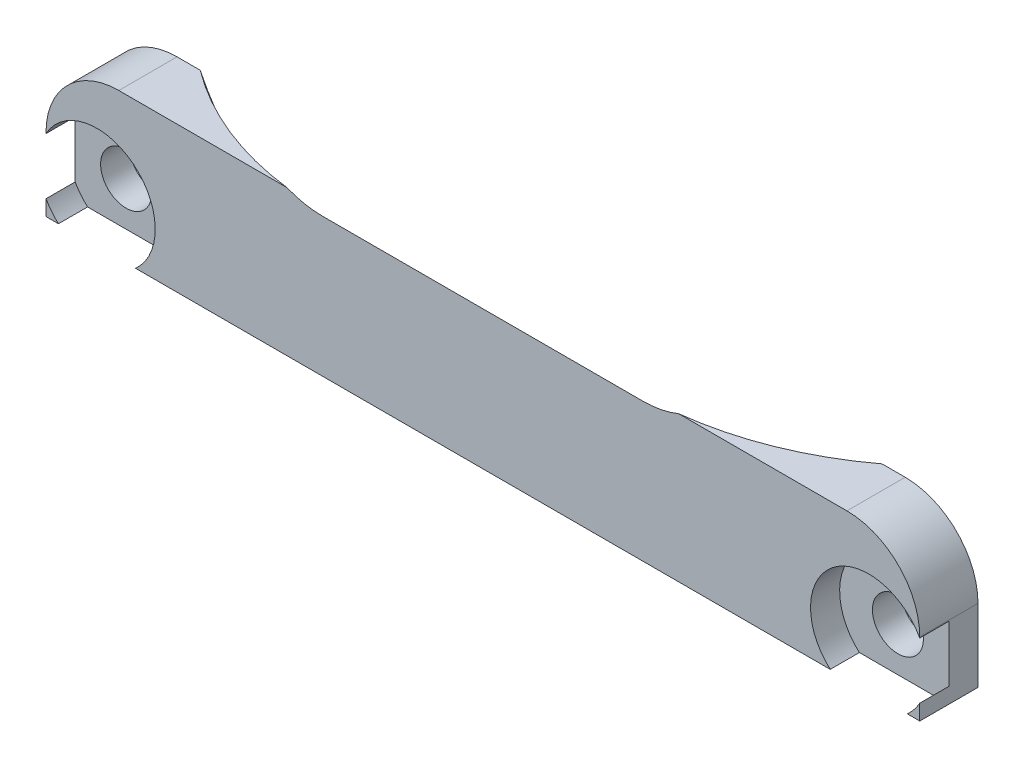
ISO-10303-21;
HEADER;
FILE_DESCRIPTION(('STEP AP214'),'2;1');
FILE_NAME('part.step','',(''),(''),'','','');
FILE_SCHEMA(('AUTOMOTIVE_DESIGN { 1 0 10303 214 1 1 1 1 }'));
ENDSEC;
DATA;
#1=APPLICATION_CONTEXT('core data for automotive mechanical design processes');
#2=APPLICATION_PROTOCOL_DEFINITION('international standard','automotive_design',2000,#1);
#3=PRODUCT_CONTEXT('',#1,'mechanical');
#4=PRODUCT('Part','Part','',(#3));
#5=PRODUCT_RELATED_PRODUCT_CATEGORY('part','',(#4));
#6=PRODUCT_DEFINITION_FORMATION('','',#4);
#7=PRODUCT_DEFINITION_CONTEXT('part definition',#1,'design');
#8=PRODUCT_DEFINITION('design','',#6,#7);
#9=PRODUCT_DEFINITION_SHAPE('','',#8);
#10=(LENGTH_UNIT() NAMED_UNIT(*) SI_UNIT(.MILLI.,.METRE.));
#11=(NAMED_UNIT(*) PLANE_ANGLE_UNIT() SI_UNIT($,.RADIAN.));
#12=(NAMED_UNIT(*) SI_UNIT($,.STERADIAN.) SOLID_ANGLE_UNIT());
#13=UNCERTAINTY_MEASURE_WITH_UNIT(LENGTH_MEASURE(1.E-05),#10,'distance_accuracy_value','');
#14=(GEOMETRIC_REPRESENTATION_CONTEXT(3) GLOBAL_UNCERTAINTY_ASSIGNED_CONTEXT((#13)) GLOBAL_UNIT_ASSIGNED_CONTEXT((#10,
#11,#12)) REPRESENTATION_CONTEXT('',''));
#15=CARTESIAN_POINT('',(0.,0.,0.));
#16=DIRECTION('',(0.,0.,1.));
#17=DIRECTION('',(1.,0.,0.));
#18=AXIS2_PLACEMENT_3D('',#15,#16,#17);
#19=CARTESIAN_POINT('',(0.,0.,20.5));
#20=DIRECTION('',(0.,0.,1.));
#21=DIRECTION('',(1.,0.,0.));
#22=AXIS2_PLACEMENT_3D('',#19,#20,#21);
#23=PLANE('',#22);
#24=CARTESIAN_POINT('',(26.5,-2.,20.5));
#25=DIRECTION('',(0.,0.,1.));
#26=DIRECTION('',(1.,0.,0.));
#27=AXIS2_PLACEMENT_3D('',#24,#25,#26);
#28=CIRCLE('',#27,4.);
#29=CARTESIAN_POINT('',(30.,-0.0635083268963044,20.5));
#30=VERTEX_POINT('',#29);
#31=CARTESIAN_POINT('',(23.8542486889354,-5.,20.5));
#32=VERTEX_POINT('',#31);
#33=EDGE_CURVE('E236',#30,#32,#28,.T.);
#34=ORIENTED_EDGE('',*,*,#33,.F.);
#35=DIRECTION('',(0.,1.,0.));
#36=VECTOR('',#35,1.);
#37=CARTESIAN_POINT('',(30.,5.,20.5));
#38=LINE('',#37,#36);
#39=CARTESIAN_POINT('',(30.,0.,20.5));
#40=VERTEX_POINT('',#39);
#41=EDGE_CURVE('E304',#30,#40,#38,.T.);
#42=ORIENTED_EDGE('',*,*,#41,.T.);
#43=CARTESIAN_POINT('',(25.,0.,20.5));
#44=DIRECTION('',(0.,0.,1.));
#45=DIRECTION('',(1.,0.,0.));
#46=AXIS2_PLACEMENT_3D('',#43,#44,#45);
#47=CIRCLE('',#46,5.);
#48=CARTESIAN_POINT('',(25.,5.,20.5));
#49=VERTEX_POINT('',#48);
#50=EDGE_CURVE('E220',#40,#49,#47,.T.);
#51=ORIENTED_EDGE('',*,*,#50,.T.);
#52=DIRECTION('',(-1.,0.,0.));
#53=VECTOR('',#52,1.);
#54=CARTESIAN_POINT('',(-30.,5.,20.5));
#55=LINE('',#54,#53);
#56=CARTESIAN_POINT('',(13.4494897427831,5.,20.5));
#57=VERTEX_POINT('',#56);
#58=EDGE_CURVE('E195',#49,#57,#55,.T.);
#59=ORIENTED_EDGE('',*,*,#58,.T.);
#60=CARTESIAN_POINT('',(11.,11.,20.5));
#61=DIRECTION('',(0.,0.,1.));
#62=DIRECTION('',(1.,0.,0.));
#63=AXIS2_PLACEMENT_3D('',#60,#61,#62);
#64=CIRCLE('',#63,6.48074069840783);
#65=CARTESIAN_POINT('',(11.,4.51925930159217,20.5));
#66=VERTEX_POINT('',#65);
#67=EDGE_CURVE('E293',#66,#57,#64,.T.);
#68=ORIENTED_EDGE('',*,*,#67,.F.);
#69=DIRECTION('',(-1.,0.,0.));
#70=VECTOR('',#69,1.);
#71=CARTESIAN_POINT('',(-32.5,4.51925930159217,20.5));
#72=LINE('',#71,#70);
#73=CARTESIAN_POINT('',(-11.,4.51925930159217,20.5));
#74=VERTEX_POINT('',#73);
#75=EDGE_CURVE('E296',#74,#66,#72,.F.);
#76=ORIENTED_EDGE('',*,*,#75,.F.);
#77=CARTESIAN_POINT('',(-11.,11.,20.5));
#78=DIRECTION('',(0.,0.,1.));
#79=DIRECTION('',(1.,0.,0.));
#80=AXIS2_PLACEMENT_3D('',#77,#78,#79);
#81=CIRCLE('',#80,6.48074069840783);
#82=CARTESIAN_POINT('',(-13.4494897427831,5.,20.5));
#83=VERTEX_POINT('',#82);
#84=EDGE_CURVE('E302',#83,#74,#81,.T.);
#85=ORIENTED_EDGE('',*,*,#84,.F.);
#86=CARTESIAN_POINT('',(-25.,5.,20.5));
#87=VERTEX_POINT('',#86);
#88=EDGE_CURVE('E307',#83,#87,#55,.T.);
#89=ORIENTED_EDGE('',*,*,#88,.T.);
#90=CARTESIAN_POINT('',(-25.,0.,20.5));
#91=DIRECTION('',(0.,0.,1.));
#92=DIRECTION('',(1.,0.,0.));
#93=AXIS2_PLACEMENT_3D('',#90,#91,#92);
#94=CIRCLE('',#93,5.);
#95=CARTESIAN_POINT('',(-30.,0.,20.5));
#96=VERTEX_POINT('',#95);
#97=EDGE_CURVE('E188',#87,#96,#94,.T.);
#98=ORIENTED_EDGE('',*,*,#97,.T.);
#99=DIRECTION('',(0.,-1.,0.));
#100=VECTOR('',#99,1.);
#101=CARTESIAN_POINT('',(-30.,5.,20.5));
#102=LINE('',#101,#100);
#103=CARTESIAN_POINT('',(-30.,-0.0635083268962795,20.5));
#104=VERTEX_POINT('',#103);
#105=EDGE_CURVE('E179',#96,#104,#102,.T.);
#106=ORIENTED_EDGE('',*,*,#105,.T.);
#107=CARTESIAN_POINT('',(-26.5,-2.,20.5));
#108=DIRECTION('',(0.,0.,1.));
#109=DIRECTION('',(1.,0.,0.));
#110=AXIS2_PLACEMENT_3D('',#107,#108,#109);
#111=CIRCLE('',#110,4.);
#112=CARTESIAN_POINT('',(-23.8542486889354,-5.,20.5));
#113=VERTEX_POINT('',#112);
#114=EDGE_CURVE('E162',#113,#104,#111,.T.);
#115=ORIENTED_EDGE('',*,*,#114,.F.);
#116=DIRECTION('',(1.,0.,0.));
#117=VECTOR('',#116,1.);
#118=CARTESIAN_POINT('',(-30.,-5.,20.5));
#119=LINE('',#118,#117);
#120=EDGE_CURVE('E192',#113,#32,#119,.T.);
#121=ORIENTED_EDGE('',*,*,#120,.T.);
#122=EDGE_LOOP('',(#34,#42,#51,#59,#68,#76,#85,#89,#98,#106,#115,#121));
#123=FACE_BOUND('',#122,.T.);
#124=ADVANCED_FACE('F37',(#123),#23,.T.);
#125=CARTESIAN_POINT('',(-30.,-3.93649167310372,20.5));
#126=VERTEX_POINT('',#125);
#127=CARTESIAN_POINT('',(-29.1457513110646,-5.,20.5));
#128=VERTEX_POINT('',#127);
#129=EDGE_CURVE('E171',#126,#128,#111,.T.);
#130=ORIENTED_EDGE('',*,*,#129,.F.);
#131=CARTESIAN_POINT('',(-30.,-5.,20.5));
#132=VERTEX_POINT('',#131);
#133=EDGE_CURVE('E190',#126,#132,#102,.T.);
#134=ORIENTED_EDGE('',*,*,#133,.T.);
#135=EDGE_CURVE('E194',#132,#128,#119,.T.);
#136=ORIENTED_EDGE('',*,*,#135,.T.);
#137=EDGE_LOOP('',(#130,#134,#136));
#138=FACE_BOUND('',#137,.T.);
#139=ADVANCED_FACE('F361',(#138),#23,.T.);
#140=CARTESIAN_POINT('',(26.5,-2.,16.5));
#141=DIRECTION('',(0.,0.,1.));
#142=DIRECTION('',(1.,0.,0.));
#143=AXIS2_PLACEMENT_3D('',#140,#141,#142);
#144=CYLINDRICAL_SURFACE('',#143,1.75);
#145=CARTESIAN_POINT('',(26.5,-2.,16.5));
#146=DIRECTION('',(0.,0.,1.));
#147=DIRECTION('',(1.,0.,0.));
#148=AXIS2_PLACEMENT_3D('',#145,#146,#147);
#149=CIRCLE('',#148,1.75);
#150=CARTESIAN_POINT('',(28.25,-2.,16.5));
#151=VERTEX_POINT('',#150);
#152=EDGE_CURVE('E262',#151,#151,#149,.T.);
#153=ORIENTED_EDGE('',*,*,#152,.F.);
#154=EDGE_LOOP('',(#153));
#155=FACE_BOUND('',#154,.T.);
#156=CARTESIAN_POINT('',(26.5,-2.,18.5));
#157=DIRECTION('',(0.,0.,1.));
#158=DIRECTION('',(1.,0.,0.));
#159=AXIS2_PLACEMENT_3D('',#156,#157,#158);
#160=CIRCLE('',#159,1.75);
#161=CARTESIAN_POINT('',(28.25,-2.,18.5));
#162=VERTEX_POINT('',#161);
#163=EDGE_CURVE('E41',#162,#162,#160,.F.);
#164=ORIENTED_EDGE('',*,*,#163,.F.);
#165=EDGE_LOOP('',(#164));
#166=FACE_BOUND('',#165,.T.);
#167=ADVANCED_FACE('F363',(#155,#166),#144,.F.);
#168=CARTESIAN_POINT('',(-26.5,-2.,16.5));
#169=DIRECTION('',(0.,0.,1.));
#170=DIRECTION('',(1.,0.,0.));
#171=AXIS2_PLACEMENT_3D('',#168,#169,#170);
#172=CYLINDRICAL_SURFACE('',#171,1.75);
#173=CARTESIAN_POINT('',(-26.5,-2.,16.5));
#174=DIRECTION('',(0.,0.,1.));
#175=DIRECTION('',(1.,0.,0.));
#176=AXIS2_PLACEMENT_3D('',#173,#174,#175);
#177=CIRCLE('',#176,1.75);
#178=CARTESIAN_POINT('',(-24.75,-2.,16.5));
#179=VERTEX_POINT('',#178);
#180=EDGE_CURVE('E263',#179,#179,#177,.T.);
#181=ORIENTED_EDGE('',*,*,#180,.F.);
#182=EDGE_LOOP('',(#181));
#183=FACE_BOUND('',#182,.T.);
#184=CARTESIAN_POINT('',(-26.5,-2.,18.5));
#185=DIRECTION('',(0.,0.,1.));
#186=DIRECTION('',(1.,0.,0.));
#187=AXIS2_PLACEMENT_3D('',#184,#185,#186);
#188=CIRCLE('',#187,1.75);
#189=CARTESIAN_POINT('',(-24.75,-2.,18.5));
#190=VERTEX_POINT('',#189);
#191=EDGE_CURVE('E222',#190,#190,#188,.F.);
#192=ORIENTED_EDGE('',*,*,#191,.F.);
#193=EDGE_LOOP('',(#192));
#194=FACE_BOUND('',#193,.T.);
#195=ADVANCED_FACE('F369',(#183,#194),#172,.F.);
#196=CARTESIAN_POINT('',(-30.,5.,20.5));
#197=DIRECTION('',(0.,-1.,0.));
#198=DIRECTION('',(0.,0.,-1.));
#199=AXIS2_PLACEMENT_3D('',#196,#197,#198);
#200=PLANE('',#199);
#201=DIRECTION('',(1.,0.,0.));
#202=VECTOR('',#201,1.);
#203=CARTESIAN_POINT('',(-30.,5.,16.5));
#204=LINE('',#203,#202);
#205=CARTESIAN_POINT('',(-25.,5.,16.5));
#206=VERTEX_POINT('',#205);
#207=CARTESIAN_POINT('',(-23.4096736459908,5.,16.5));
#208=VERTEX_POINT('',#207);
#209=EDGE_CURVE('E273',#206,#208,#204,.T.);
#210=ORIENTED_EDGE('',*,*,#209,.F.);
#211=DIRECTION('',(0.,0.,-1.));
#212=VECTOR('',#211,1.);
#213=CARTESIAN_POINT('',(-25.,5.,20.5));
#214=LINE('',#213,#212);
#215=EDGE_CURVE('E11',#206,#87,#214,.F.);
#216=ORIENTED_EDGE('',*,*,#215,.T.);
#217=ORIENTED_EDGE('',*,*,#88,.F.);
#218=CARTESIAN_POINT('',(-11.,5.,0.));
#219=DIRECTION('',(0.,-1.,0.));
#220=DIRECTION('',(0.,0.,-1.));
#221=AXIS2_PLACEMENT_3D('',#218,#219,#220);
#222=CIRCLE('',#221,20.6458228220626);
#223=EDGE_CURVE('E299',#83,#208,#222,.T.);
#224=ORIENTED_EDGE('',*,*,#223,.T.);
#225=EDGE_LOOP('',(#210,#216,#217,#224));
#226=FACE_BOUND('',#225,.T.);
#227=ADVANCED_FACE('F340',(#226),#200,.F.);
#228=CARTESIAN_POINT('',(30.,5.,20.5));
#229=DIRECTION('',(-1.,0.,0.));
#230=DIRECTION('',(0.,0.,1.));
#231=AXIS2_PLACEMENT_3D('',#228,#229,#230);
#232=PLANE('',#231);
#233=DIRECTION('',(0.,1.,0.));
#234=VECTOR('',#233,1.);
#235=CARTESIAN_POINT('',(30.,5.,18.5));
#236=LINE('',#235,#234);
#237=CARTESIAN_POINT('',(30.,-3.93649167310369,18.5));
#238=VERTEX_POINT('',#237);
#239=CARTESIAN_POINT('',(30.,-0.0635083268963044,18.5));
#240=VERTEX_POINT('',#239);
#241=EDGE_CURVE('E245',#238,#240,#236,.T.);
#242=ORIENTED_EDGE('',*,*,#241,.F.);
#243=DIRECTION('',(0.,0.,1.));
#244=VECTOR('',#243,1.);
#245=CARTESIAN_POINT('',(30.,-3.93649167310369,18.5));
#246=LINE('',#245,#244);
#247=CARTESIAN_POINT('',(30.,-3.93649167310369,20.5));
#248=VERTEX_POINT('',#247);
#249=EDGE_CURVE('E259',#238,#248,#246,.T.);
#250=ORIENTED_EDGE('',*,*,#249,.T.);
#251=CARTESIAN_POINT('',(30.,-5.,20.5));
#252=VERTEX_POINT('',#251);
#253=EDGE_CURVE('E305',#252,#248,#38,.T.);
#254=ORIENTED_EDGE('',*,*,#253,.F.);
#255=DIRECTION('',(0.,0.,-1.));
#256=VECTOR('',#255,1.);
#257=CARTESIAN_POINT('',(30.,-5.,20.5));
#258=LINE('',#257,#256);
#259=CARTESIAN_POINT('',(30.,-5.,16.5));
#260=VERTEX_POINT('',#259);
#261=EDGE_CURVE('E200',#252,#260,#258,.T.);
#262=ORIENTED_EDGE('',*,*,#261,.T.);
#263=DIRECTION('',(0.,1.,0.));
#264=VECTOR('',#263,1.);
#265=CARTESIAN_POINT('',(30.,-5.,16.5));
#266=LINE('',#265,#264);
#267=CARTESIAN_POINT('',(30.,0.,16.5));
#268=VERTEX_POINT('',#267);
#269=EDGE_CURVE('E275',#260,#268,#266,.T.);
#270=ORIENTED_EDGE('',*,*,#269,.T.);
#271=DIRECTION('',(0.,0.,-1.));
#272=VECTOR('',#271,1.);
#273=CARTESIAN_POINT('',(30.,0.,20.5));
#274=LINE('',#273,#272);
#275=EDGE_CURVE('E216',#268,#40,#274,.F.);
#276=ORIENTED_EDGE('',*,*,#275,.T.);
#277=ORIENTED_EDGE('',*,*,#41,.F.);
#278=DIRECTION('',(0.,0.,1.));
#279=VECTOR('',#278,1.);
#280=CARTESIAN_POINT('',(30.,-0.0635083268963044,18.5));
#281=LINE('',#280,#279);
#282=EDGE_CURVE('E256',#30,#240,#281,.F.);
#283=ORIENTED_EDGE('',*,*,#282,.T.);
#284=EDGE_LOOP('',(#242,#250,#254,#262,#270,#276,#277,#283));
#285=FACE_BOUND('',#284,.T.);
#286=ADVANCED_FACE('F316',(#285),#232,.F.);
#287=ORIENTED_EDGE('',*,*,#58,.F.);
#288=DIRECTION('',(0.,0.,-1.));
#289=VECTOR('',#288,1.);
#290=CARTESIAN_POINT('',(25.,5.,20.5));
#291=LINE('',#290,#289);
#292=CARTESIAN_POINT('',(25.,5.,16.5));
#293=VERTEX_POINT('',#292);
#294=EDGE_CURVE('E209',#49,#293,#291,.T.);
#295=ORIENTED_EDGE('',*,*,#294,.T.);
#296=CARTESIAN_POINT('',(23.4096736459908,5.,16.5));
#297=VERTEX_POINT('',#296);
#298=EDGE_CURVE('E266',#297,#293,#204,.T.);
#299=ORIENTED_EDGE('',*,*,#298,.F.);
#300=CARTESIAN_POINT('',(11.,5.,0.));
#301=DIRECTION('',(0.,-1.,0.));
#302=DIRECTION('',(0.,0.,-1.));
#303=AXIS2_PLACEMENT_3D('',#300,#301,#302);
#304=CIRCLE('',#303,20.6458228220626);
#305=EDGE_CURVE('E290',#297,#57,#304,.T.);
#306=ORIENTED_EDGE('',*,*,#305,.T.);
#307=EDGE_LOOP('',(#287,#295,#299,#306));
#308=FACE_BOUND('',#307,.T.);
#309=ADVANCED_FACE('F323',(#308),#200,.F.);
#310=CARTESIAN_POINT('',(-30.,5.,20.5));
#311=DIRECTION('',(1.,0.,0.));
#312=DIRECTION('',(0.,0.,-1.));
#313=AXIS2_PLACEMENT_3D('',#310,#311,#312);
#314=PLANE('',#313);
#315=DIRECTION('',(0.,-1.,0.));
#316=VECTOR('',#315,1.);
#317=CARTESIAN_POINT('',(-30.,5.,18.5));
#318=LINE('',#317,#316);
#319=CARTESIAN_POINT('',(-30.,-0.0635083268962795,18.5));
#320=VERTEX_POINT('',#319);
#321=CARTESIAN_POINT('',(-30.,-3.93649167310372,18.5));
#322=VERTEX_POINT('',#321);
#323=EDGE_CURVE('E182',#320,#322,#318,.T.);
#324=ORIENTED_EDGE('',*,*,#323,.F.);
#325=DIRECTION('',(0.,0.,1.));
#326=VECTOR('',#325,1.);
#327=CARTESIAN_POINT('',(-30.,-0.0635083268962795,18.5));
#328=LINE('',#327,#326);
#329=EDGE_CURVE('E165',#320,#104,#328,.T.);
#330=ORIENTED_EDGE('',*,*,#329,.T.);
#331=ORIENTED_EDGE('',*,*,#105,.F.);
#332=DIRECTION('',(0.,0.,-1.));
#333=VECTOR('',#332,1.);
#334=CARTESIAN_POINT('',(-30.,0.,20.5));
#335=LINE('',#334,#333);
#336=CARTESIAN_POINT('',(-30.,0.,16.5));
#337=VERTEX_POINT('',#336);
#338=EDGE_CURVE('E46',#96,#337,#335,.T.);
#339=ORIENTED_EDGE('',*,*,#338,.T.);
#340=DIRECTION('',(0.,1.,0.));
#341=VECTOR('',#340,1.);
#342=CARTESIAN_POINT('',(-30.,-5.,16.5));
#343=LINE('',#342,#341);
#344=CARTESIAN_POINT('',(-30.,-5.,16.5));
#345=VERTEX_POINT('',#344);
#346=EDGE_CURVE('E272',#345,#337,#343,.T.);
#347=ORIENTED_EDGE('',*,*,#346,.F.);
#348=DIRECTION('',(0.,0.,-1.));
#349=VECTOR('',#348,1.);
#350=CARTESIAN_POINT('',(-30.,-5.,20.5));
#351=LINE('',#350,#349);
#352=EDGE_CURVE('E203',#132,#345,#351,.T.);
#353=ORIENTED_EDGE('',*,*,#352,.F.);
#354=ORIENTED_EDGE('',*,*,#133,.F.);
#355=DIRECTION('',(0.,0.,1.));
#356=VECTOR('',#355,1.);
#357=CARTESIAN_POINT('',(-30.,-3.93649167310372,18.5));
#358=LINE('',#357,#356);
#359=EDGE_CURVE('E183',#126,#322,#358,.F.);
#360=ORIENTED_EDGE('',*,*,#359,.T.);
#361=EDGE_LOOP('',(#324,#330,#331,#339,#347,#353,#354,#360));
#362=FACE_BOUND('',#361,.T.);
#363=ADVANCED_FACE('F177',(#362),#314,.F.);
#364=CARTESIAN_POINT('',(-30.,-5.,20.5));
#365=DIRECTION('',(0.,1.,0.));
#366=DIRECTION('',(0.,0.,1.));
#367=AXIS2_PLACEMENT_3D('',#364,#365,#366);
#368=PLANE('',#367);
#369=DIRECTION('',(1.,0.,0.));
#370=VECTOR('',#369,1.);
#371=CARTESIAN_POINT('',(-30.,-5.,18.5));
#372=LINE('',#371,#370);
#373=CARTESIAN_POINT('',(23.8542486889354,-5.,18.5));
#374=VERTEX_POINT('',#373);
#375=CARTESIAN_POINT('',(29.1457513110646,-5.,18.5));
#376=VERTEX_POINT('',#375);
#377=EDGE_CURVE('E243',#374,#376,#372,.T.);
#378=ORIENTED_EDGE('',*,*,#377,.F.);
#379=DIRECTION('',(0.,0.,1.));
#380=VECTOR('',#379,1.);
#381=CARTESIAN_POINT('',(23.8542486889354,-5.,18.5));
#382=LINE('',#381,#380);
#383=EDGE_CURVE('E253',#374,#32,#382,.T.);
#384=ORIENTED_EDGE('',*,*,#383,.T.);
#385=ORIENTED_EDGE('',*,*,#120,.F.);
#386=DIRECTION('',(0.,0.,1.));
#387=VECTOR('',#386,1.);
#388=CARTESIAN_POINT('',(-23.8542486889354,-5.,18.5));
#389=LINE('',#388,#387);
#390=CARTESIAN_POINT('',(-23.8542486889354,-5.,18.5));
#391=VERTEX_POINT('',#390);
#392=EDGE_CURVE('E62',#113,#391,#389,.F.);
#393=ORIENTED_EDGE('',*,*,#392,.T.);
#394=DIRECTION('',(1.,0.,0.));
#395=VECTOR('',#394,1.);
#396=CARTESIAN_POINT('',(-30.,-5.,18.5));
#397=LINE('',#396,#395);
#398=CARTESIAN_POINT('',(-29.1457513110646,-5.,18.5));
#399=VERTEX_POINT('',#398);
#400=EDGE_CURVE('E224',#399,#391,#397,.T.);
#401=ORIENTED_EDGE('',*,*,#400,.F.);
#402=DIRECTION('',(0.,0.,1.));
#403=VECTOR('',#402,1.);
#404=CARTESIAN_POINT('',(-29.1457513110646,-5.,18.5));
#405=LINE('',#404,#403);
#406=EDGE_CURVE('E248',#399,#128,#405,.T.);
#407=ORIENTED_EDGE('',*,*,#406,.T.);
#408=ORIENTED_EDGE('',*,*,#135,.F.);
#409=ORIENTED_EDGE('',*,*,#352,.T.);
#410=DIRECTION('',(1.,0.,0.));
#411=VECTOR('',#410,1.);
#412=CARTESIAN_POINT('',(-30.,-5.,16.5));
#413=LINE('',#412,#411);
#414=EDGE_CURVE('E269',#345,#260,#413,.T.);
#415=ORIENTED_EDGE('',*,*,#414,.T.);
#416=ORIENTED_EDGE('',*,*,#261,.F.);
#417=CARTESIAN_POINT('',(29.1457513110646,-5.,20.5));
#418=VERTEX_POINT('',#417);
#419=EDGE_CURVE('E189',#418,#252,#119,.T.);
#420=ORIENTED_EDGE('',*,*,#419,.F.);
#421=DIRECTION('',(0.,0.,1.));
#422=VECTOR('',#421,1.);
#423=CARTESIAN_POINT('',(29.1457513110646,-5.,18.5));
#424=LINE('',#423,#422);
#425=EDGE_CURVE('E54',#418,#376,#424,.F.);
#426=ORIENTED_EDGE('',*,*,#425,.T.);
#427=EDGE_LOOP('',(#378,#384,#385,#393,#401,#407,#408,#409,#415,#416,#420,#426));
#428=FACE_BOUND('',#427,.T.);
#429=ADVANCED_FACE('F347',(#428),#368,.F.);
#430=EDGE_CURVE('E238',#418,#248,#28,.T.);
#431=ORIENTED_EDGE('',*,*,#430,.F.);
#432=ORIENTED_EDGE('',*,*,#419,.T.);
#433=ORIENTED_EDGE('',*,*,#253,.T.);
#434=EDGE_LOOP('',(#431,#432,#433));
#435=FACE_BOUND('',#434,.T.);
#436=ADVANCED_FACE('F352',(#435),#23,.T.);
#437=CARTESIAN_POINT('',(-11.,11.,0.));
#438=DIRECTION('',(-1.,0.,0.));
#439=DIRECTION('',(0.,1.,0.));
#440=AXIS2_PLACEMENT_3D('',#437,#438,#439);
#441=SPHERICAL_SURFACE('',#440,21.5);
#442=CARTESIAN_POINT('',(-11.,11.,0.));
#443=DIRECTION('',(-1.,0.,0.));
#444=DIRECTION('',(0.,-1.,0.));
#445=AXIS2_PLACEMENT_3D('',#442,#443,#444);
#446=CIRCLE('',#445,21.5);
#447=CARTESIAN_POINT('',(-11.,-2.7840487520902,16.5));
#448=VERTEX_POINT('',#447);
#449=EDGE_CURVE('E288',#448,#74,#446,.T.);
#450=ORIENTED_EDGE('',*,*,#449,.F.);
#451=CARTESIAN_POINT('',(-11.,11.,16.5));
#452=DIRECTION('',(0.,0.,1.));
#453=DIRECTION('',(1.,0.,0.));
#454=AXIS2_PLACEMENT_3D('',#451,#452,#453);
#455=CIRCLE('',#454,13.7840487520902);
#456=EDGE_CURVE('E283',#448,#208,#455,.F.);
#457=ORIENTED_EDGE('',*,*,#456,.T.);
#458=ORIENTED_EDGE('',*,*,#223,.F.);
#459=ORIENTED_EDGE('',*,*,#84,.T.);
#460=EDGE_LOOP('',(#450,#457,#458,#459));
#461=FACE_BOUND('',#460,.T.);
#462=ADVANCED_FACE('F375',(#461),#441,.F.);
#463=CARTESIAN_POINT('',(-32.5,11.,0.));
#464=DIRECTION('',(-1.,0.,0.));
#465=DIRECTION('',(0.,-1.,0.));
#466=AXIS2_PLACEMENT_3D('',#463,#464,#465);
#467=CYLINDRICAL_SURFACE('',#466,21.5);
#468=CARTESIAN_POINT('',(11.,11.,0.));
#469=DIRECTION('',(-1.,0.,0.));
#470=DIRECTION('',(0.,-1.,0.));
#471=AXIS2_PLACEMENT_3D('',#468,#469,#470);
#472=CIRCLE('',#471,21.5);
#473=CARTESIAN_POINT('',(11.,-2.78404875209021,16.5));
#474=VERTEX_POINT('',#473);
#475=EDGE_CURVE('E286',#474,#66,#472,.T.);
#476=ORIENTED_EDGE('',*,*,#475,.F.);
#477=DIRECTION('',(-1.,0.,0.));
#478=VECTOR('',#477,1.);
#479=CARTESIAN_POINT('',(-32.5,-2.78404875209021,16.5));
#480=LINE('',#479,#478);
#481=EDGE_CURVE('E278',#474,#448,#480,.T.);
#482=ORIENTED_EDGE('',*,*,#481,.T.);
#483=ORIENTED_EDGE('',*,*,#449,.T.);
#484=ORIENTED_EDGE('',*,*,#75,.T.);
#485=EDGE_LOOP('',(#476,#482,#483,#484));
#486=FACE_BOUND('',#485,.T.);
#487=ADVANCED_FACE('F331',(#486),#467,.F.);
#488=CARTESIAN_POINT('',(11.,11.,0.));
#489=DIRECTION('',(-1.,0.,0.));
#490=DIRECTION('',(0.,-1.,0.));
#491=AXIS2_PLACEMENT_3D('',#488,#489,#490);
#492=SPHERICAL_SURFACE('',#491,21.5);
#493=ORIENTED_EDGE('',*,*,#305,.F.);
#494=CARTESIAN_POINT('',(11.,11.,16.5));
#495=DIRECTION('',(0.,0.,1.));
#496=DIRECTION('',(1.,0.,0.));
#497=AXIS2_PLACEMENT_3D('',#494,#495,#496);
#498=CIRCLE('',#497,13.7840487520902);
#499=EDGE_CURVE('E206',#297,#474,#498,.F.);
#500=ORIENTED_EDGE('',*,*,#499,.T.);
#501=ORIENTED_EDGE('',*,*,#475,.T.);
#502=ORIENTED_EDGE('',*,*,#67,.T.);
#503=EDGE_LOOP('',(#493,#500,#501,#502));
#504=FACE_BOUND('',#503,.T.);
#505=ADVANCED_FACE('F329',(#504),#492,.F.);
#506=CARTESIAN_POINT('',(-30.,-5.,16.5));
#507=DIRECTION('',(0.,0.,1.));
#508=DIRECTION('',(1.,0.,0.));
#509=AXIS2_PLACEMENT_3D('',#506,#507,#508);
#510=PLANE('',#509);
#511=ORIENTED_EDGE('',*,*,#180,.T.);
#512=EDGE_LOOP('',(#511));
#513=FACE_BOUND('',#512,.T.);
#514=ORIENTED_EDGE('',*,*,#152,.T.);
#515=EDGE_LOOP('',(#514));
#516=FACE_BOUND('',#515,.T.);
#517=ORIENTED_EDGE('',*,*,#298,.T.);
#518=CARTESIAN_POINT('',(25.,0.,16.5));
#519=DIRECTION('',(0.,0.,1.));
#520=DIRECTION('',(1.,0.,0.));
#521=AXIS2_PLACEMENT_3D('',#518,#519,#520);
#522=CIRCLE('',#521,5.);
#523=EDGE_CURVE('E214',#293,#268,#522,.F.);
#524=ORIENTED_EDGE('',*,*,#523,.T.);
#525=ORIENTED_EDGE('',*,*,#269,.F.);
#526=ORIENTED_EDGE('',*,*,#414,.F.);
#527=ORIENTED_EDGE('',*,*,#346,.T.);
#528=CARTESIAN_POINT('',(-25.,0.,16.5));
#529=DIRECTION('',(0.,0.,1.));
#530=DIRECTION('',(1.,0.,0.));
#531=AXIS2_PLACEMENT_3D('',#528,#529,#530);
#532=CIRCLE('',#531,5.);
#533=EDGE_CURVE('E212',#337,#206,#532,.F.);
#534=ORIENTED_EDGE('',*,*,#533,.T.);
#535=ORIENTED_EDGE('',*,*,#209,.T.);
#536=ORIENTED_EDGE('',*,*,#456,.F.);
#537=ORIENTED_EDGE('',*,*,#481,.F.);
#538=ORIENTED_EDGE('',*,*,#499,.F.);
#539=EDGE_LOOP('',(#517,#524,#525,#526,#527,#534,#535,#536,#537,#538));
#540=FACE_BOUND('',#539,.T.);
#541=ADVANCED_FACE('F326',(#513,#516,#540),#510,.F.);
#542=CARTESIAN_POINT('',(25.,0.,20.5));
#543=DIRECTION('',(0.,0.,-1.));
#544=DIRECTION('',(-1.,0.,0.));
#545=AXIS2_PLACEMENT_3D('',#542,#543,#544);
#546=CYLINDRICAL_SURFACE('',#545,5.);
#547=ORIENTED_EDGE('',*,*,#50,.F.);
#548=ORIENTED_EDGE('',*,*,#275,.F.);
#549=ORIENTED_EDGE('',*,*,#523,.F.);
#550=ORIENTED_EDGE('',*,*,#294,.F.);
#551=EDGE_LOOP('',(#547,#548,#549,#550));
#552=FACE_BOUND('',#551,.T.);
#553=ADVANCED_FACE('F319',(#552),#546,.T.);
#554=CARTESIAN_POINT('',(-25.,0.,20.5));
#555=DIRECTION('',(0.,0.,-1.));
#556=DIRECTION('',(-1.,0.,0.));
#557=AXIS2_PLACEMENT_3D('',#554,#555,#556);
#558=CYLINDRICAL_SURFACE('',#557,5.);
#559=ORIENTED_EDGE('',*,*,#97,.F.);
#560=ORIENTED_EDGE('',*,*,#215,.F.);
#561=ORIENTED_EDGE('',*,*,#533,.F.);
#562=ORIENTED_EDGE('',*,*,#338,.F.);
#563=EDGE_LOOP('',(#559,#560,#561,#562));
#564=FACE_BOUND('',#563,.T.);
#565=ADVANCED_FACE('F39',(#564),#558,.T.);
#566=CARTESIAN_POINT('',(-26.5,-2.,18.5));
#567=DIRECTION('',(0.,0.,1.));
#568=DIRECTION('',(1.,0.,0.));
#569=AXIS2_PLACEMENT_3D('',#566,#567,#568);
#570=CYLINDRICAL_SURFACE('',#569,4.);
#571=CARTESIAN_POINT('',(-26.5,-2.,18.5));
#572=DIRECTION('',(0.,0.,1.));
#573=DIRECTION('',(1.,0.,0.));
#574=AXIS2_PLACEMENT_3D('',#571,#572,#573);
#575=CIRCLE('',#574,4.);
#576=EDGE_CURVE('E240',#391,#320,#575,.T.);
#577=ORIENTED_EDGE('',*,*,#576,.F.);
#578=ORIENTED_EDGE('',*,*,#392,.F.);
#579=ORIENTED_EDGE('',*,*,#114,.T.);
#580=ORIENTED_EDGE('',*,*,#329,.F.);
#581=EDGE_LOOP('',(#577,#578,#579,#580));
#582=FACE_BOUND('',#581,.T.);
#583=ADVANCED_FACE('F164',(#582),#570,.F.);
#584=ORIENTED_EDGE('',*,*,#129,.T.);
#585=ORIENTED_EDGE('',*,*,#406,.F.);
#586=EDGE_CURVE('E172',#322,#399,#575,.T.);
#587=ORIENTED_EDGE('',*,*,#586,.F.);
#588=ORIENTED_EDGE('',*,*,#359,.F.);
#589=EDGE_LOOP('',(#584,#585,#587,#588));
#590=FACE_BOUND('',#589,.T.);
#591=ADVANCED_FACE('F355',(#590),#570,.F.);
#592=CARTESIAN_POINT('',(-26.5,-2.,18.5));
#593=DIRECTION('',(0.,0.,1.));
#594=DIRECTION('',(1.,0.,0.));
#595=AXIS2_PLACEMENT_3D('',#592,#593,#594);
#596=PLANE('',#595);
#597=ORIENTED_EDGE('',*,*,#191,.T.);
#598=EDGE_LOOP('',(#597));
#599=FACE_BOUND('',#598,.T.);
#600=ORIENTED_EDGE('',*,*,#323,.T.);
#601=ORIENTED_EDGE('',*,*,#586,.T.);
#602=ORIENTED_EDGE('',*,*,#400,.T.);
#603=ORIENTED_EDGE('',*,*,#576,.T.);
#604=EDGE_LOOP('',(#600,#601,#602,#603));
#605=FACE_BOUND('',#604,.T.);
#606=ADVANCED_FACE('F510',(#599,#605),#596,.T.);
#607=CARTESIAN_POINT('',(26.5,-2.,18.5));
#608=DIRECTION('',(0.,0.,1.));
#609=DIRECTION('',(1.,0.,0.));
#610=AXIS2_PLACEMENT_3D('',#607,#608,#609);
#611=CYLINDRICAL_SURFACE('',#610,4.);
#612=CARTESIAN_POINT('',(26.5,-2.,18.5));
#613=DIRECTION('',(0.,0.,1.));
#614=DIRECTION('',(1.,0.,0.));
#615=AXIS2_PLACEMENT_3D('',#612,#613,#614);
#616=CIRCLE('',#615,4.);
#617=EDGE_CURVE('E230',#376,#238,#616,.T.);
#618=ORIENTED_EDGE('',*,*,#617,.F.);
#619=ORIENTED_EDGE('',*,*,#425,.F.);
#620=ORIENTED_EDGE('',*,*,#430,.T.);
#621=ORIENTED_EDGE('',*,*,#249,.F.);
#622=EDGE_LOOP('',(#618,#619,#620,#621));
#623=FACE_BOUND('',#622,.T.);
#624=ADVANCED_FACE('F350',(#623),#611,.F.);
#625=ORIENTED_EDGE('',*,*,#33,.T.);
#626=ORIENTED_EDGE('',*,*,#383,.F.);
#627=EDGE_CURVE('E225',#240,#374,#616,.T.);
#628=ORIENTED_EDGE('',*,*,#627,.F.);
#629=ORIENTED_EDGE('',*,*,#282,.F.);
#630=EDGE_LOOP('',(#625,#626,#628,#629));
#631=FACE_BOUND('',#630,.T.);
#632=ADVANCED_FACE('F528',(#631),#611,.F.);
#633=CARTESIAN_POINT('',(26.5,-2.,18.5));
#634=DIRECTION('',(0.,0.,1.));
#635=DIRECTION('',(1.,0.,0.));
#636=AXIS2_PLACEMENT_3D('',#633,#634,#635);
#637=PLANE('',#636);
#638=ORIENTED_EDGE('',*,*,#163,.T.);
#639=EDGE_LOOP('',(#638));
#640=FACE_BOUND('',#639,.T.);
#641=ORIENTED_EDGE('',*,*,#241,.T.);
#642=ORIENTED_EDGE('',*,*,#627,.T.);
#643=ORIENTED_EDGE('',*,*,#377,.T.);
#644=ORIENTED_EDGE('',*,*,#617,.T.);
#645=EDGE_LOOP('',(#641,#642,#643,#644));
#646=FACE_BOUND('',#645,.T.);
#647=ADVANCED_FACE('F351',(#640,#646),#637,.T.);
#648=CLOSED_SHELL('',(#124,#139,#167,#195,#227,#286,#309,#363,#429,#436,#462,#487,#505,#541,
#553,#565,#583,#591,#606,#624,#632,#647));
#649=MANIFOLD_SOLID_BREP('B2',#648);
#650=ADVANCED_BREP_SHAPE_REPRESENTATION('',(#18,#649),#14);
#651=SHAPE_DEFINITION_REPRESENTATION(#9,#650);
ENDSEC;
END-ISO-10303-21;
